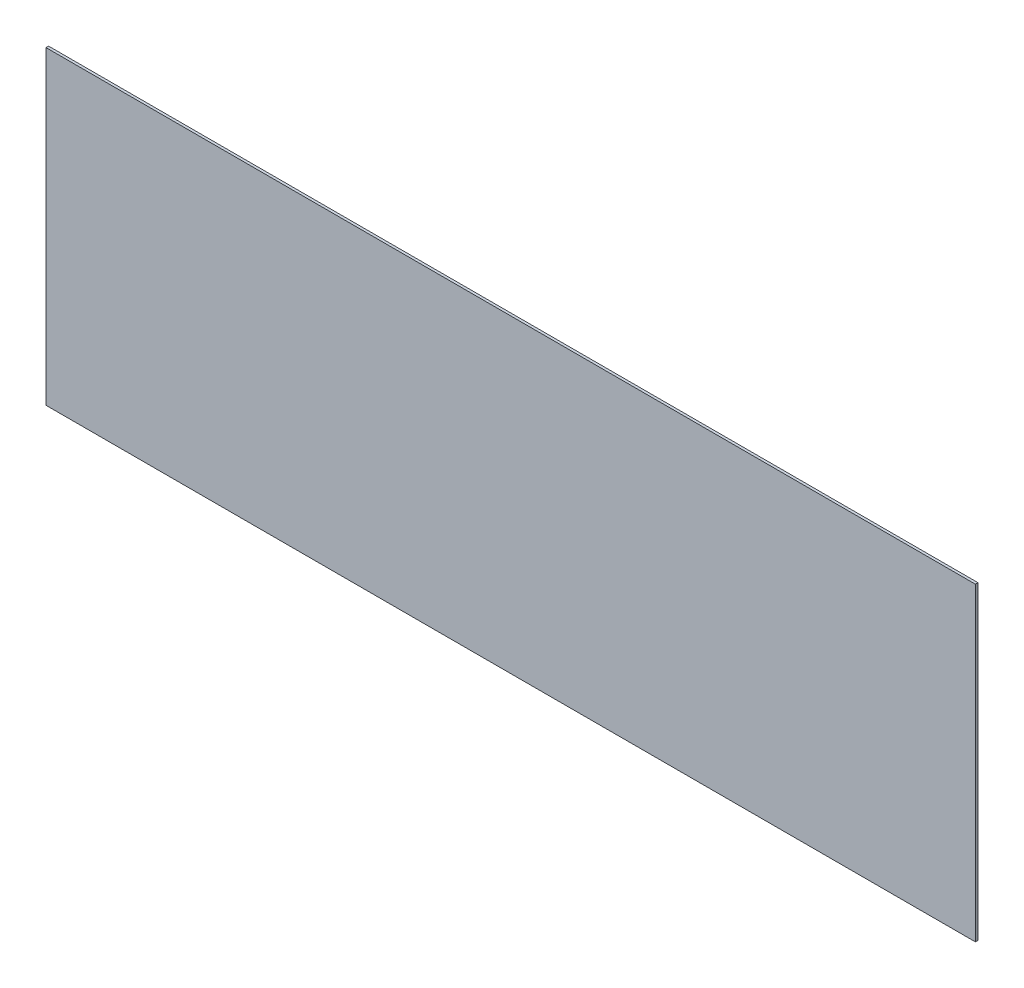
ISO-10303-21;
HEADER;
FILE_DESCRIPTION(('STEP AP214'),'2;1');
FILE_NAME('part.step','',(''),(''),'','','');
FILE_SCHEMA(('AUTOMOTIVE_DESIGN { 1 0 10303 214 1 1 1 1 }'));
ENDSEC;
DATA;
#1=APPLICATION_CONTEXT('core data for automotive mechanical design processes');
#2=APPLICATION_PROTOCOL_DEFINITION('international standard','automotive_design',2000,#1);
#3=PRODUCT_CONTEXT('',#1,'mechanical');
#4=PRODUCT('Part','Part','',(#3));
#5=PRODUCT_RELATED_PRODUCT_CATEGORY('part','',(#4));
#6=PRODUCT_DEFINITION_FORMATION('','',#4);
#7=PRODUCT_DEFINITION_CONTEXT('part definition',#1,'design');
#8=PRODUCT_DEFINITION('design','',#6,#7);
#9=PRODUCT_DEFINITION_SHAPE('','',#8);
#10=(LENGTH_UNIT() NAMED_UNIT(*) SI_UNIT(.MILLI.,.METRE.));
#11=(NAMED_UNIT(*) PLANE_ANGLE_UNIT() SI_UNIT($,.RADIAN.));
#12=(NAMED_UNIT(*) SI_UNIT($,.STERADIAN.) SOLID_ANGLE_UNIT());
#13=UNCERTAINTY_MEASURE_WITH_UNIT(LENGTH_MEASURE(1.E-05),#10,'distance_accuracy_value','');
#14=(GEOMETRIC_REPRESENTATION_CONTEXT(3) GLOBAL_UNCERTAINTY_ASSIGNED_CONTEXT((#13)) GLOBAL_UNIT_ASSIGNED_CONTEXT((#10,
#11,#12)) REPRESENTATION_CONTEXT('',''));
#15=CARTESIAN_POINT('',(0.,0.,0.));
#16=DIRECTION('',(0.,0.,1.));
#17=DIRECTION('',(1.,0.,0.));
#18=AXIS2_PLACEMENT_3D('',#15,#16,#17);
#19=CARTESIAN_POINT('',(900.,300.,5.));
#20=DIRECTION('',(-1.,0.,0.));
#21=DIRECTION('',(0.,-1.,0.));
#22=AXIS2_PLACEMENT_3D('',#19,#20,#21);
#23=PLANE('',#22);
#24=DIRECTION('',(0.,1.,0.));
#25=VECTOR('',#24,1.);
#26=CARTESIAN_POINT('',(900.,300.,0.));
#27=LINE('',#26,#25);
#28=CARTESIAN_POINT('',(900.,-300.,0.));
#29=VERTEX_POINT('',#28);
#30=CARTESIAN_POINT('',(900.,300.,0.));
#31=VERTEX_POINT('',#30);
#32=EDGE_CURVE('E95',#29,#31,#27,.T.);
#33=ORIENTED_EDGE('',*,*,#32,.T.);
#34=DIRECTION('',(0.,0.,-1.));
#35=VECTOR('',#34,1.);
#36=CARTESIAN_POINT('',(900.,300.,5.));
#37=LINE('',#36,#35);
#38=CARTESIAN_POINT('',(900.,300.,5.));
#39=VERTEX_POINT('',#38);
#40=EDGE_CURVE('E11',#39,#31,#37,.T.);
#41=ORIENTED_EDGE('',*,*,#40,.F.);
#42=DIRECTION('',(0.,1.,0.));
#43=VECTOR('',#42,1.);
#44=CARTESIAN_POINT('',(900.,300.,5.));
#45=LINE('',#44,#43);
#46=CARTESIAN_POINT('',(900.,-300.,5.));
#47=VERTEX_POINT('',#46);
#48=EDGE_CURVE('E83',#47,#39,#45,.T.);
#49=ORIENTED_EDGE('',*,*,#48,.F.);
#50=DIRECTION('',(0.,0.,-1.));
#51=VECTOR('',#50,1.);
#52=CARTESIAN_POINT('',(900.,-300.,5.));
#53=LINE('',#52,#51);
#54=EDGE_CURVE('E91',#47,#29,#53,.T.);
#55=ORIENTED_EDGE('',*,*,#54,.T.);
#56=EDGE_LOOP('',(#33,#41,#49,#55));
#57=FACE_BOUND('',#56,.T.);
#58=ADVANCED_FACE('F32',(#57),#23,.F.);
#59=CARTESIAN_POINT('',(-900.,300.,5.));
#60=DIRECTION('',(0.,-1.,0.));
#61=DIRECTION('',(0.,0.,-1.));
#62=AXIS2_PLACEMENT_3D('',#59,#60,#61);
#63=PLANE('',#62);
#64=DIRECTION('',(-1.,0.,0.));
#65=VECTOR('',#64,1.);
#66=CARTESIAN_POINT('',(-900.,300.,0.));
#67=LINE('',#66,#65);
#68=CARTESIAN_POINT('',(-900.,300.,0.));
#69=VERTEX_POINT('',#68);
#70=EDGE_CURVE('E87',#31,#69,#67,.T.);
#71=ORIENTED_EDGE('',*,*,#70,.T.);
#72=DIRECTION('',(0.,0.,-1.));
#73=VECTOR('',#72,1.);
#74=CARTESIAN_POINT('',(-900.,300.,5.));
#75=LINE('',#74,#73);
#76=CARTESIAN_POINT('',(-900.,300.,5.));
#77=VERTEX_POINT('',#76);
#78=EDGE_CURVE('E40',#77,#69,#75,.T.);
#79=ORIENTED_EDGE('',*,*,#78,.F.);
#80=DIRECTION('',(-1.,0.,0.));
#81=VECTOR('',#80,1.);
#82=CARTESIAN_POINT('',(-900.,300.,5.));
#83=LINE('',#82,#81);
#84=EDGE_CURVE('E78',#39,#77,#83,.T.);
#85=ORIENTED_EDGE('',*,*,#84,.F.);
#86=ORIENTED_EDGE('',*,*,#40,.T.);
#87=EDGE_LOOP('',(#71,#79,#85,#86));
#88=FACE_BOUND('',#87,.T.);
#89=ADVANCED_FACE('F86',(#88),#63,.F.);
#90=CARTESIAN_POINT('',(-900.,300.,5.));
#91=DIRECTION('',(1.,0.,0.));
#92=DIRECTION('',(0.,1.,0.));
#93=AXIS2_PLACEMENT_3D('',#90,#91,#92);
#94=PLANE('',#93);
#95=DIRECTION('',(0.,-1.,0.));
#96=VECTOR('',#95,1.);
#97=CARTESIAN_POINT('',(-900.,300.,0.));
#98=LINE('',#97,#96);
#99=CARTESIAN_POINT('',(-900.,-300.,0.));
#100=VERTEX_POINT('',#99);
#101=EDGE_CURVE('E65',#69,#100,#98,.T.);
#102=ORIENTED_EDGE('',*,*,#101,.T.);
#103=DIRECTION('',(0.,0.,-1.));
#104=VECTOR('',#103,1.);
#105=CARTESIAN_POINT('',(-900.,-300.,5.));
#106=LINE('',#105,#104);
#107=CARTESIAN_POINT('',(-900.,-300.,5.));
#108=VERTEX_POINT('',#107);
#109=EDGE_CURVE('E88',#108,#100,#106,.T.);
#110=ORIENTED_EDGE('',*,*,#109,.F.);
#111=DIRECTION('',(0.,-1.,0.));
#112=VECTOR('',#111,1.);
#113=CARTESIAN_POINT('',(-900.,300.,5.));
#114=LINE('',#113,#112);
#115=EDGE_CURVE('E81',#77,#108,#114,.T.);
#116=ORIENTED_EDGE('',*,*,#115,.F.);
#117=ORIENTED_EDGE('',*,*,#78,.T.);
#118=EDGE_LOOP('',(#102,#110,#116,#117));
#119=FACE_BOUND('',#118,.T.);
#120=ADVANCED_FACE('F89',(#119),#94,.F.);
#121=CARTESIAN_POINT('',(-900.,-300.,5.));
#122=DIRECTION('',(0.,1.,0.));
#123=DIRECTION('',(0.,0.,1.));
#124=AXIS2_PLACEMENT_3D('',#121,#122,#123);
#125=PLANE('',#124);
#126=DIRECTION('',(1.,0.,0.));
#127=VECTOR('',#126,1.);
#128=CARTESIAN_POINT('',(-900.,-300.,0.));
#129=LINE('',#128,#127);
#130=EDGE_CURVE('E71',#100,#29,#129,.T.);
#131=ORIENTED_EDGE('',*,*,#130,.T.);
#132=ORIENTED_EDGE('',*,*,#54,.F.);
#133=DIRECTION('',(1.,0.,0.));
#134=VECTOR('',#133,1.);
#135=CARTESIAN_POINT('',(-900.,-300.,5.));
#136=LINE('',#135,#134);
#137=EDGE_CURVE('E48',#108,#47,#136,.T.);
#138=ORIENTED_EDGE('',*,*,#137,.F.);
#139=ORIENTED_EDGE('',*,*,#109,.T.);
#140=EDGE_LOOP('',(#131,#132,#138,#139));
#141=FACE_BOUND('',#140,.T.);
#142=ADVANCED_FACE('F102',(#141),#125,.F.);
#143=CARTESIAN_POINT('',(0.,0.,5.));
#144=DIRECTION('',(0.,0.,1.));
#145=DIRECTION('',(1.,0.,0.));
#146=AXIS2_PLACEMENT_3D('',#143,#144,#145);
#147=PLANE('',#146);
#148=ORIENTED_EDGE('',*,*,#48,.T.);
#149=ORIENTED_EDGE('',*,*,#84,.T.);
#150=ORIENTED_EDGE('',*,*,#115,.T.);
#151=ORIENTED_EDGE('',*,*,#137,.T.);
#152=EDGE_LOOP('',(#148,#149,#150,#151));
#153=FACE_BOUND('',#152,.T.);
#154=ADVANCED_FACE('F79',(#153),#147,.T.);
#155=CARTESIAN_POINT('',(0.,0.,0.));
#156=DIRECTION('',(0.,0.,1.));
#157=DIRECTION('',(1.,0.,0.));
#158=AXIS2_PLACEMENT_3D('',#155,#156,#157);
#159=PLANE('',#158);
#160=ORIENTED_EDGE('',*,*,#32,.F.);
#161=ORIENTED_EDGE('',*,*,#130,.F.);
#162=ORIENTED_EDGE('',*,*,#101,.F.);
#163=ORIENTED_EDGE('',*,*,#70,.F.);
#164=EDGE_LOOP('',(#160,#161,#162,#163));
#165=FACE_BOUND('',#164,.T.);
#166=ADVANCED_FACE('F105',(#165),#159,.F.);
#167=CLOSED_SHELL('',(#58,#89,#120,#142,#154,#166));
#168=MANIFOLD_SOLID_BREP('B2',#167);
#169=ADVANCED_BREP_SHAPE_REPRESENTATION('',(#18,#168),#14);
#170=SHAPE_DEFINITION_REPRESENTATION(#9,#169);
ENDSEC;
END-ISO-10303-21;
